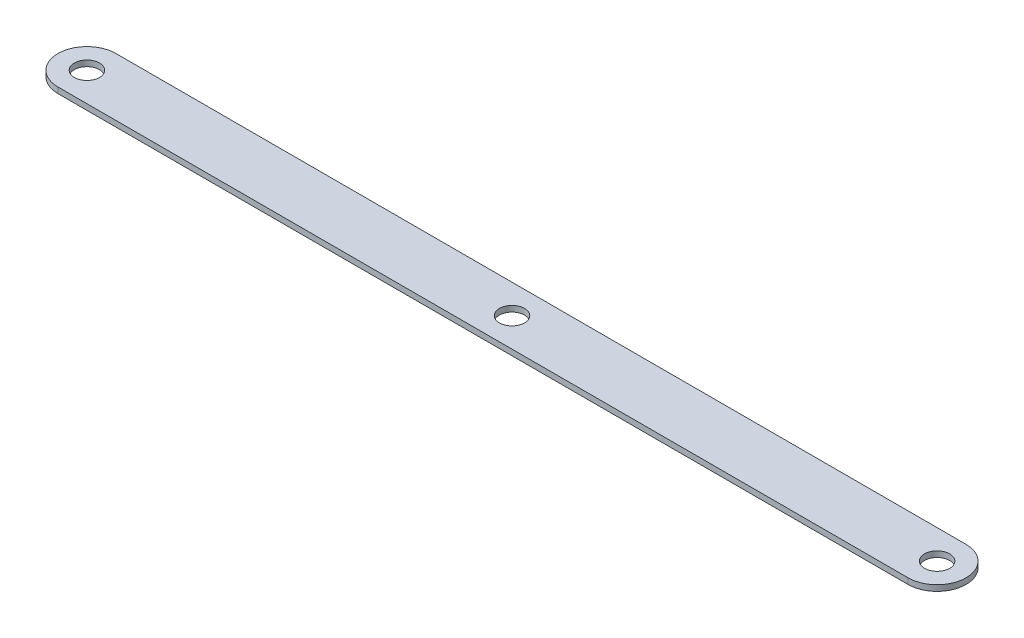
ISO-10303-21;
HEADER;
FILE_DESCRIPTION(('STEP AP214'),'2;1');
FILE_NAME('part.step','',(''),(''),'','','');
FILE_SCHEMA(('AUTOMOTIVE_DESIGN { 1 0 10303 214 1 1 1 1 }'));
ENDSEC;
DATA;
#1=APPLICATION_CONTEXT('core data for automotive mechanical design processes');
#2=APPLICATION_PROTOCOL_DEFINITION('international standard','automotive_design',2000,#1);
#3=PRODUCT_CONTEXT('',#1,'mechanical');
#4=PRODUCT('Part','Part','',(#3));
#5=PRODUCT_RELATED_PRODUCT_CATEGORY('part','',(#4));
#6=PRODUCT_DEFINITION_FORMATION('','',#4);
#7=PRODUCT_DEFINITION_CONTEXT('part definition',#1,'design');
#8=PRODUCT_DEFINITION('design','',#6,#7);
#9=PRODUCT_DEFINITION_SHAPE('','',#8);
#10=(LENGTH_UNIT() NAMED_UNIT(*) SI_UNIT(.MILLI.,.METRE.));
#11=(NAMED_UNIT(*) PLANE_ANGLE_UNIT() SI_UNIT($,.RADIAN.));
#12=(NAMED_UNIT(*) SI_UNIT($,.STERADIAN.) SOLID_ANGLE_UNIT());
#13=UNCERTAINTY_MEASURE_WITH_UNIT(LENGTH_MEASURE(1.E-05),#10,'distance_accuracy_value','');
#14=(GEOMETRIC_REPRESENTATION_CONTEXT(3) GLOBAL_UNCERTAINTY_ASSIGNED_CONTEXT((#13)) GLOBAL_UNIT_ASSIGNED_CONTEXT((#10,
#11,#12)) REPRESENTATION_CONTEXT('',''));
#15=CARTESIAN_POINT('',(0.,0.,0.));
#16=DIRECTION('',(0.,0.,1.));
#17=DIRECTION('',(1.,0.,0.));
#18=AXIS2_PLACEMENT_3D('',#15,#16,#17);
#19=CARTESIAN_POINT('',(110.,1.5,0.));
#20=DIRECTION('',(0.,-1.,0.));
#21=DIRECTION('',(0.,0.,-1.));
#22=AXIS2_PLACEMENT_3D('',#19,#20,#21);
#23=CYLINDRICAL_SURFACE('',#22,7.5);
#24=CARTESIAN_POINT('',(110.,0.,0.));
#25=DIRECTION('',(0.,1.,0.));
#26=DIRECTION('',(0.,0.,1.));
#27=AXIS2_PLACEMENT_3D('',#24,#25,#26);
#28=CIRCLE('',#27,7.5);
#29=CARTESIAN_POINT('',(110.,0.,7.49999999999996));
#30=VERTEX_POINT('',#29);
#31=CARTESIAN_POINT('',(110.,0.,-7.50000000000004));
#32=VERTEX_POINT('',#31);
#33=EDGE_CURVE('E114',#30,#32,#28,.T.);
#34=ORIENTED_EDGE('',*,*,#33,.T.);
#35=DIRECTION('',(0.,-1.,0.));
#36=VECTOR('',#35,1.);
#37=CARTESIAN_POINT('',(110.,1.5,-7.50000000000004));
#38=LINE('',#37,#36);
#39=CARTESIAN_POINT('',(110.,1.5,-7.50000000000004));
#40=VERTEX_POINT('',#39);
#41=EDGE_CURVE('E11',#40,#32,#38,.T.);
#42=ORIENTED_EDGE('',*,*,#41,.F.);
#43=CARTESIAN_POINT('',(110.,1.5,0.));
#44=DIRECTION('',(0.,1.,0.));
#45=DIRECTION('',(0.,0.,1.));
#46=AXIS2_PLACEMENT_3D('',#43,#44,#45);
#47=CIRCLE('',#46,7.5);
#48=CARTESIAN_POINT('',(110.,1.5,7.49999999999996));
#49=VERTEX_POINT('',#48);
#50=EDGE_CURVE('E100',#49,#40,#47,.T.);
#51=ORIENTED_EDGE('',*,*,#50,.F.);
#52=DIRECTION('',(0.,-1.,0.));
#53=VECTOR('',#52,1.);
#54=CARTESIAN_POINT('',(110.,1.5,7.49999999999996));
#55=LINE('',#54,#53);
#56=EDGE_CURVE('E108',#49,#30,#55,.T.);
#57=ORIENTED_EDGE('',*,*,#56,.T.);
#58=EDGE_LOOP('',(#34,#42,#51,#57));
#59=FACE_BOUND('',#58,.T.);
#60=ADVANCED_FACE('F44',(#59),#23,.T.);
#61=CARTESIAN_POINT('',(110.,1.5,-7.50000000000004));
#62=DIRECTION('',(0.,0.,1.));
#63=DIRECTION('',(1.,0.,0.));
#64=AXIS2_PLACEMENT_3D('',#61,#62,#63);
#65=PLANE('',#64);
#66=DIRECTION('',(-1.,0.,0.));
#67=VECTOR('',#66,1.);
#68=CARTESIAN_POINT('',(110.,0.,-7.50000000000004));
#69=LINE('',#68,#67);
#70=CARTESIAN_POINT('',(-110.,0.,-7.49999999999997));
#71=VERTEX_POINT('',#70);
#72=EDGE_CURVE('E105',#32,#71,#69,.T.);
#73=ORIENTED_EDGE('',*,*,#72,.T.);
#74=DIRECTION('',(0.,-1.,0.));
#75=VECTOR('',#74,1.);
#76=CARTESIAN_POINT('',(-110.,1.5,-7.49999999999997));
#77=LINE('',#76,#75);
#78=CARTESIAN_POINT('',(-110.,1.5,-7.49999999999997));
#79=VERTEX_POINT('',#78);
#80=EDGE_CURVE('E53',#79,#71,#77,.T.);
#81=ORIENTED_EDGE('',*,*,#80,.F.);
#82=DIRECTION('',(-1.,0.,0.));
#83=VECTOR('',#82,1.);
#84=CARTESIAN_POINT('',(110.,1.5,-7.50000000000004));
#85=LINE('',#84,#83);
#86=EDGE_CURVE('E95',#40,#79,#85,.T.);
#87=ORIENTED_EDGE('',*,*,#86,.F.);
#88=ORIENTED_EDGE('',*,*,#41,.T.);
#89=EDGE_LOOP('',(#73,#81,#87,#88));
#90=FACE_BOUND('',#89,.T.);
#91=ADVANCED_FACE('F101',(#90),#65,.F.);
#92=CARTESIAN_POINT('',(-110.,1.5,0.));
#93=DIRECTION('',(0.,-1.,0.));
#94=DIRECTION('',(0.,0.,-1.));
#95=AXIS2_PLACEMENT_3D('',#92,#93,#94);
#96=CYLINDRICAL_SURFACE('',#95,7.5);
#97=CARTESIAN_POINT('',(-110.,0.,0.));
#98=DIRECTION('',(0.,1.,0.));
#99=DIRECTION('',(0.,0.,1.));
#100=AXIS2_PLACEMENT_3D('',#97,#98,#99);
#101=CIRCLE('',#100,7.5);
#102=CARTESIAN_POINT('',(-110.,0.,7.50000000000003));
#103=VERTEX_POINT('',#102);
#104=EDGE_CURVE('E76',#71,#103,#101,.T.);
#105=ORIENTED_EDGE('',*,*,#104,.T.);
#106=DIRECTION('',(0.,-1.,0.));
#107=VECTOR('',#106,1.);
#108=CARTESIAN_POINT('',(-110.,1.5,7.50000000000003));
#109=LINE('',#108,#107);
#110=CARTESIAN_POINT('',(-110.,1.5,7.50000000000003));
#111=VERTEX_POINT('',#110);
#112=EDGE_CURVE('E102',#111,#103,#109,.T.);
#113=ORIENTED_EDGE('',*,*,#112,.F.);
#114=CARTESIAN_POINT('',(-110.,1.5,0.));
#115=DIRECTION('',(0.,1.,0.));
#116=DIRECTION('',(0.,0.,1.));
#117=AXIS2_PLACEMENT_3D('',#114,#115,#116);
#118=CIRCLE('',#117,7.5);
#119=EDGE_CURVE('E92',#79,#111,#118,.T.);
#120=ORIENTED_EDGE('',*,*,#119,.F.);
#121=ORIENTED_EDGE('',*,*,#80,.T.);
#122=EDGE_LOOP('',(#105,#113,#120,#121));
#123=FACE_BOUND('',#122,.T.);
#124=ADVANCED_FACE('F104',(#123),#96,.T.);
#125=CARTESIAN_POINT('',(110.,1.5,7.49999999999996));
#126=DIRECTION('',(0.,0.,-1.));
#127=DIRECTION('',(-1.,0.,0.));
#128=AXIS2_PLACEMENT_3D('',#125,#126,#127);
#129=PLANE('',#128);
#130=DIRECTION('',(1.,0.,0.));
#131=VECTOR('',#130,1.);
#132=CARTESIAN_POINT('',(110.,0.,7.49999999999996));
#133=LINE('',#132,#131);
#134=EDGE_CURVE('E82',#103,#30,#133,.T.);
#135=ORIENTED_EDGE('',*,*,#134,.T.);
#136=ORIENTED_EDGE('',*,*,#56,.F.);
#137=DIRECTION('',(1.,0.,0.));
#138=VECTOR('',#137,1.);
#139=CARTESIAN_POINT('',(110.,1.5,7.49999999999996));
#140=LINE('',#139,#138);
#141=EDGE_CURVE('E65',#111,#49,#140,.T.);
#142=ORIENTED_EDGE('',*,*,#141,.F.);
#143=ORIENTED_EDGE('',*,*,#112,.T.);
#144=EDGE_LOOP('',(#135,#136,#142,#143));
#145=FACE_BOUND('',#144,.T.);
#146=ADVANCED_FACE('F130',(#145),#129,.F.);
#147=CARTESIAN_POINT('',(110.,1.5,0.));
#148=DIRECTION('',(0.,1.,0.));
#149=DIRECTION('',(0.,0.,1.));
#150=AXIS2_PLACEMENT_3D('',#147,#148,#149);
#151=PLANE('',#150);
#152=CARTESIAN_POINT('',(110.,1.5,0.));
#153=DIRECTION('',(0.,1.,0.));
#154=DIRECTION('',(0.,0.,1.));
#155=AXIS2_PLACEMENT_3D('',#152,#153,#154);
#156=CIRCLE('',#155,3.25000000000001);
#157=CARTESIAN_POINT('',(110.,1.5,3.24999999999997));
#158=VERTEX_POINT('',#157);
#159=EDGE_CURVE('E147',#158,#158,#156,.T.);
#160=ORIENTED_EDGE('',*,*,#159,.F.);
#161=EDGE_LOOP('',(#160));
#162=FACE_BOUND('',#161,.T.);
#163=CARTESIAN_POINT('',(0.,1.5,0.));
#164=DIRECTION('',(0.,1.,0.));
#165=DIRECTION('',(0.,0.,1.));
#166=AXIS2_PLACEMENT_3D('',#163,#164,#165);
#167=CIRCLE('',#166,3.25);
#168=CARTESIAN_POINT('',(0.,1.5,3.25));
#169=VERTEX_POINT('',#168);
#170=EDGE_CURVE('E148',#169,#169,#167,.T.);
#171=ORIENTED_EDGE('',*,*,#170,.F.);
#172=EDGE_LOOP('',(#171));
#173=FACE_BOUND('',#172,.T.);
#174=CARTESIAN_POINT('',(-110.,1.5,0.));
#175=DIRECTION('',(0.,1.,0.));
#176=DIRECTION('',(0.,0.,1.));
#177=AXIS2_PLACEMENT_3D('',#174,#175,#176);
#178=CIRCLE('',#177,3.25000000000001);
#179=CARTESIAN_POINT('',(-110.,1.5,3.25000000000003));
#180=VERTEX_POINT('',#179);
#181=EDGE_CURVE('E140',#180,#180,#178,.T.);
#182=ORIENTED_EDGE('',*,*,#181,.F.);
#183=EDGE_LOOP('',(#182));
#184=FACE_BOUND('',#183,.T.);
#185=ORIENTED_EDGE('',*,*,#50,.T.);
#186=ORIENTED_EDGE('',*,*,#86,.T.);
#187=ORIENTED_EDGE('',*,*,#119,.T.);
#188=ORIENTED_EDGE('',*,*,#141,.T.);
#189=EDGE_LOOP('',(#185,#186,#187,#188));
#190=FACE_BOUND('',#189,.T.);
#191=ADVANCED_FACE('F91',(#162,#173,#184,#190),#151,.T.);
#192=CARTESIAN_POINT('',(110.,0.,0.));
#193=DIRECTION('',(0.,1.,0.));
#194=DIRECTION('',(0.,0.,1.));
#195=AXIS2_PLACEMENT_3D('',#192,#193,#194);
#196=PLANE('',#195);
#197=CARTESIAN_POINT('',(110.,0.,0.));
#198=DIRECTION('',(0.,1.,0.));
#199=DIRECTION('',(0.,0.,1.));
#200=AXIS2_PLACEMENT_3D('',#197,#198,#199);
#201=CIRCLE('',#200,3.25000000000001);
#202=CARTESIAN_POINT('',(110.,0.,3.24999999999997));
#203=VERTEX_POINT('',#202);
#204=EDGE_CURVE('E120',#203,#203,#201,.T.);
#205=ORIENTED_EDGE('',*,*,#204,.T.);
#206=EDGE_LOOP('',(#205));
#207=FACE_BOUND('',#206,.T.);
#208=CARTESIAN_POINT('',(0.,0.,0.));
#209=DIRECTION('',(0.,1.,0.));
#210=DIRECTION('',(0.,0.,1.));
#211=AXIS2_PLACEMENT_3D('',#208,#209,#210);
#212=CIRCLE('',#211,3.25);
#213=CARTESIAN_POINT('',(0.,0.,3.25));
#214=VERTEX_POINT('',#213);
#215=EDGE_CURVE('E142',#214,#214,#212,.T.);
#216=ORIENTED_EDGE('',*,*,#215,.T.);
#217=EDGE_LOOP('',(#216));
#218=FACE_BOUND('',#217,.T.);
#219=CARTESIAN_POINT('',(-110.,0.,0.));
#220=DIRECTION('',(0.,1.,0.));
#221=DIRECTION('',(0.,0.,1.));
#222=AXIS2_PLACEMENT_3D('',#219,#220,#221);
#223=CIRCLE('',#222,3.25000000000001);
#224=CARTESIAN_POINT('',(-110.,0.,3.25000000000003));
#225=VERTEX_POINT('',#224);
#226=EDGE_CURVE('E131',#225,#225,#223,.T.);
#227=ORIENTED_EDGE('',*,*,#226,.T.);
#228=EDGE_LOOP('',(#227));
#229=FACE_BOUND('',#228,.T.);
#230=ORIENTED_EDGE('',*,*,#33,.F.);
#231=ORIENTED_EDGE('',*,*,#134,.F.);
#232=ORIENTED_EDGE('',*,*,#104,.F.);
#233=ORIENTED_EDGE('',*,*,#72,.F.);
#234=EDGE_LOOP('',(#230,#231,#232,#233));
#235=FACE_BOUND('',#234,.T.);
#236=ADVANCED_FACE('F128',(#207,#218,#229,#235),#196,.F.);
#237=CARTESIAN_POINT('',(-110.,0.,0.));
#238=DIRECTION('',(0.,1.,0.));
#239=DIRECTION('',(0.,0.,1.));
#240=AXIS2_PLACEMENT_3D('',#237,#238,#239);
#241=CYLINDRICAL_SURFACE('',#240,3.25000000000001);
#242=ORIENTED_EDGE('',*,*,#226,.F.);
#243=EDGE_LOOP('',(#242));
#244=FACE_BOUND('',#243,.T.);
#245=ORIENTED_EDGE('',*,*,#181,.T.);
#246=EDGE_LOOP('',(#245));
#247=FACE_BOUND('',#246,.T.);
#248=ADVANCED_FACE('F171',(#244,#247),#241,.F.);
#249=CARTESIAN_POINT('',(0.,0.,0.));
#250=DIRECTION('',(0.,1.,0.));
#251=DIRECTION('',(0.,0.,1.));
#252=AXIS2_PLACEMENT_3D('',#249,#250,#251);
#253=CYLINDRICAL_SURFACE('',#252,3.25);
#254=ORIENTED_EDGE('',*,*,#215,.F.);
#255=EDGE_LOOP('',(#254));
#256=FACE_BOUND('',#255,.T.);
#257=ORIENTED_EDGE('',*,*,#170,.T.);
#258=EDGE_LOOP('',(#257));
#259=FACE_BOUND('',#258,.T.);
#260=ADVANCED_FACE('F162',(#256,#259),#253,.F.);
#261=CARTESIAN_POINT('',(110.,0.,0.));
#262=DIRECTION('',(0.,1.,0.));
#263=DIRECTION('',(0.,0.,1.));
#264=AXIS2_PLACEMENT_3D('',#261,#262,#263);
#265=CYLINDRICAL_SURFACE('',#264,3.25000000000001);
#266=ORIENTED_EDGE('',*,*,#204,.F.);
#267=EDGE_LOOP('',(#266));
#268=FACE_BOUND('',#267,.T.);
#269=ORIENTED_EDGE('',*,*,#159,.T.);
#270=EDGE_LOOP('',(#269));
#271=FACE_BOUND('',#270,.T.);
#272=ADVANCED_FACE('F159',(#268,#271),#265,.F.);
#273=CLOSED_SHELL('',(#60,#91,#124,#146,#191,#236,#248,#260,#272));
#274=MANIFOLD_SOLID_BREP('B2',#273);
#275=ADVANCED_BREP_SHAPE_REPRESENTATION('',(#18,#274),#14);
#276=SHAPE_DEFINITION_REPRESENTATION(#9,#275);
ENDSEC;
END-ISO-10303-21;
